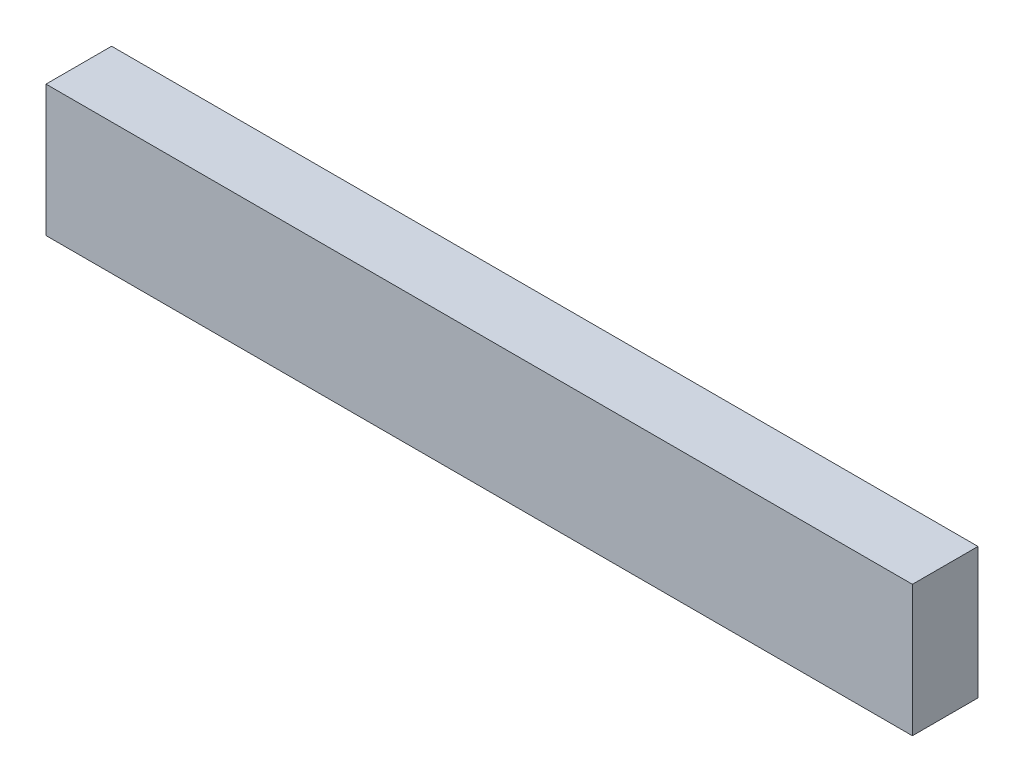
ISO-10303-21;
HEADER;
FILE_DESCRIPTION(('STEP AP214'),'2;1');
FILE_NAME('part.step','',(''),(''),'','','');
FILE_SCHEMA(('AUTOMOTIVE_DESIGN { 1 0 10303 214 1 1 1 1 }'));
ENDSEC;
DATA;
#1=APPLICATION_CONTEXT('core data for automotive mechanical design processes');
#2=APPLICATION_PROTOCOL_DEFINITION('international standard','automotive_design',2000,#1);
#3=PRODUCT_CONTEXT('',#1,'mechanical');
#4=PRODUCT('Part','Part','',(#3));
#5=PRODUCT_RELATED_PRODUCT_CATEGORY('part','',(#4));
#6=PRODUCT_DEFINITION_FORMATION('','',#4);
#7=PRODUCT_DEFINITION_CONTEXT('part definition',#1,'design');
#8=PRODUCT_DEFINITION('design','',#6,#7);
#9=PRODUCT_DEFINITION_SHAPE('','',#8);
#10=(LENGTH_UNIT() NAMED_UNIT(*) SI_UNIT(.MILLI.,.METRE.));
#11=(NAMED_UNIT(*) PLANE_ANGLE_UNIT() SI_UNIT($,.RADIAN.));
#12=(NAMED_UNIT(*) SI_UNIT($,.STERADIAN.) SOLID_ANGLE_UNIT());
#13=UNCERTAINTY_MEASURE_WITH_UNIT(LENGTH_MEASURE(1.E-05),#10,'distance_accuracy_value','');
#14=(GEOMETRIC_REPRESENTATION_CONTEXT(3) GLOBAL_UNCERTAINTY_ASSIGNED_CONTEXT((#13)) GLOBAL_UNIT_ASSIGNED_CONTEXT((#10,
#11,#12)) REPRESENTATION_CONTEXT('',''));
#15=CARTESIAN_POINT('',(0.,0.,0.));
#16=DIRECTION('',(0.,0.,1.));
#17=DIRECTION('',(1.,0.,0.));
#18=AXIS2_PLACEMENT_3D('',#15,#16,#17);
#19=CARTESIAN_POINT('',(0.,200.,0.));
#20=DIRECTION('',(1.,0.,0.));
#21=DIRECTION('',(0.,0.,-1.));
#22=AXIS2_PLACEMENT_3D('',#19,#20,#21);
#23=PLANE('',#22);
#24=DIRECTION('',(0.,0.,1.));
#25=VECTOR('',#24,1.);
#26=CARTESIAN_POINT('',(0.,0.,0.));
#27=LINE('',#26,#25);
#28=CARTESIAN_POINT('',(0.,0.,-100.));
#29=VERTEX_POINT('',#28);
#30=CARTESIAN_POINT('',(0.,0.,0.));
#31=VERTEX_POINT('',#30);
#32=EDGE_CURVE('E109',#29,#31,#27,.T.);
#33=ORIENTED_EDGE('',*,*,#32,.T.);
#34=DIRECTION('',(0.,-1.,0.));
#35=VECTOR('',#34,1.);
#36=CARTESIAN_POINT('',(0.,200.,0.));
#37=LINE('',#36,#35);
#38=CARTESIAN_POINT('',(0.,200.,0.));
#39=VERTEX_POINT('',#38);
#40=EDGE_CURVE('E11',#39,#31,#37,.T.);
#41=ORIENTED_EDGE('',*,*,#40,.F.);
#42=DIRECTION('',(0.,0.,1.));
#43=VECTOR('',#42,1.);
#44=CARTESIAN_POINT('',(0.,200.,0.));
#45=LINE('',#44,#43);
#46=CARTESIAN_POINT('',(0.,200.,-100.));
#47=VERTEX_POINT('',#46);
#48=EDGE_CURVE('E93',#47,#39,#45,.T.);
#49=ORIENTED_EDGE('',*,*,#48,.F.);
#50=DIRECTION('',(0.,-1.,0.));
#51=VECTOR('',#50,1.);
#52=CARTESIAN_POINT('',(0.,200.,-100.));
#53=LINE('',#52,#51);
#54=EDGE_CURVE('E105',#47,#29,#53,.T.);
#55=ORIENTED_EDGE('',*,*,#54,.T.);
#56=EDGE_LOOP('',(#33,#41,#49,#55));
#57=FACE_BOUND('',#56,.T.);
#58=ADVANCED_FACE('F41',(#57),#23,.F.);
#59=CARTESIAN_POINT('',(0.,200.,0.));
#60=DIRECTION('',(0.,0.,-1.));
#61=DIRECTION('',(-1.,0.,0.));
#62=AXIS2_PLACEMENT_3D('',#59,#60,#61);
#63=PLANE('',#62);
#64=DIRECTION('',(1.,0.,0.));
#65=VECTOR('',#64,1.);
#66=CARTESIAN_POINT('',(0.,0.,0.));
#67=LINE('',#66,#65);
#68=CARTESIAN_POINT('',(1320.8,0.,0.));
#69=VERTEX_POINT('',#68);
#70=EDGE_CURVE('E98',#31,#69,#67,.T.);
#71=ORIENTED_EDGE('',*,*,#70,.T.);
#72=DIRECTION('',(0.,-1.,0.));
#73=VECTOR('',#72,1.);
#74=CARTESIAN_POINT('',(1320.8,200.,0.));
#75=LINE('',#74,#73);
#76=CARTESIAN_POINT('',(1320.8,200.,0.));
#77=VERTEX_POINT('',#76);
#78=EDGE_CURVE('E50',#77,#69,#75,.T.);
#79=ORIENTED_EDGE('',*,*,#78,.F.);
#80=DIRECTION('',(1.,0.,0.));
#81=VECTOR('',#80,1.);
#82=CARTESIAN_POINT('',(0.,200.,0.));
#83=LINE('',#82,#81);
#84=EDGE_CURVE('E88',#39,#77,#83,.T.);
#85=ORIENTED_EDGE('',*,*,#84,.F.);
#86=ORIENTED_EDGE('',*,*,#40,.T.);
#87=EDGE_LOOP('',(#71,#79,#85,#86));
#88=FACE_BOUND('',#87,.T.);
#89=ADVANCED_FACE('F97',(#88),#63,.F.);
#90=CARTESIAN_POINT('',(1320.8,200.,0.));
#91=DIRECTION('',(-1.,0.,0.));
#92=DIRECTION('',(0.,0.,1.));
#93=AXIS2_PLACEMENT_3D('',#90,#91,#92);
#94=PLANE('',#93);
#95=DIRECTION('',(0.,0.,-1.));
#96=VECTOR('',#95,1.);
#97=CARTESIAN_POINT('',(1320.8,0.,0.));
#98=LINE('',#97,#96);
#99=CARTESIAN_POINT('',(1320.8,0.,-100.));
#100=VERTEX_POINT('',#99);
#101=EDGE_CURVE('E75',#69,#100,#98,.T.);
#102=ORIENTED_EDGE('',*,*,#101,.T.);
#103=DIRECTION('',(0.,-1.,0.));
#104=VECTOR('',#103,1.);
#105=CARTESIAN_POINT('',(1320.8,200.,-100.));
#106=LINE('',#105,#104);
#107=CARTESIAN_POINT('',(1320.8,200.,-100.));
#108=VERTEX_POINT('',#107);
#109=EDGE_CURVE('E100',#108,#100,#106,.T.);
#110=ORIENTED_EDGE('',*,*,#109,.F.);
#111=DIRECTION('',(0.,0.,-1.));
#112=VECTOR('',#111,1.);
#113=CARTESIAN_POINT('',(1320.8,200.,0.));
#114=LINE('',#113,#112);
#115=EDGE_CURVE('E91',#77,#108,#114,.T.);
#116=ORIENTED_EDGE('',*,*,#115,.F.);
#117=ORIENTED_EDGE('',*,*,#78,.T.);
#118=EDGE_LOOP('',(#102,#110,#116,#117));
#119=FACE_BOUND('',#118,.T.);
#120=ADVANCED_FACE('F101',(#119),#94,.F.);
#121=CARTESIAN_POINT('',(0.,200.,-100.));
#122=DIRECTION('',(0.,0.,1.));
#123=DIRECTION('',(1.,0.,0.));
#124=AXIS2_PLACEMENT_3D('',#121,#122,#123);
#125=PLANE('',#124);
#126=DIRECTION('',(-1.,0.,0.));
#127=VECTOR('',#126,1.);
#128=CARTESIAN_POINT('',(0.,0.,-100.));
#129=LINE('',#128,#127);
#130=EDGE_CURVE('E81',#100,#29,#129,.T.);
#131=ORIENTED_EDGE('',*,*,#130,.T.);
#132=ORIENTED_EDGE('',*,*,#54,.F.);
#133=DIRECTION('',(-1.,0.,0.));
#134=VECTOR('',#133,1.);
#135=CARTESIAN_POINT('',(0.,200.,-100.));
#136=LINE('',#135,#134);
#137=EDGE_CURVE('E58',#108,#47,#136,.T.);
#138=ORIENTED_EDGE('',*,*,#137,.F.);
#139=ORIENTED_EDGE('',*,*,#109,.T.);
#140=EDGE_LOOP('',(#131,#132,#138,#139));
#141=FACE_BOUND('',#140,.T.);
#142=ADVANCED_FACE('F122',(#141),#125,.F.);
#143=CARTESIAN_POINT('',(0.,200.,0.));
#144=DIRECTION('',(0.,-1.,0.));
#145=DIRECTION('',(0.,0.,-1.));
#146=AXIS2_PLACEMENT_3D('',#143,#144,#145);
#147=PLANE('',#146);
#148=ORIENTED_EDGE('',*,*,#48,.T.);
#149=ORIENTED_EDGE('',*,*,#84,.T.);
#150=ORIENTED_EDGE('',*,*,#115,.T.);
#151=ORIENTED_EDGE('',*,*,#137,.T.);
#152=EDGE_LOOP('',(#148,#149,#150,#151));
#153=FACE_BOUND('',#152,.T.);
#154=ADVANCED_FACE('F89',(#153),#147,.F.);
#155=CARTESIAN_POINT('',(0.,0.,0.));
#156=DIRECTION('',(0.,-1.,0.));
#157=DIRECTION('',(0.,0.,-1.));
#158=AXIS2_PLACEMENT_3D('',#155,#156,#157);
#159=PLANE('',#158);
#160=ORIENTED_EDGE('',*,*,#32,.F.);
#161=ORIENTED_EDGE('',*,*,#130,.F.);
#162=ORIENTED_EDGE('',*,*,#101,.F.);
#163=ORIENTED_EDGE('',*,*,#70,.F.);
#164=EDGE_LOOP('',(#160,#161,#162,#163));
#165=FACE_BOUND('',#164,.T.);
#166=ADVANCED_FACE('F125',(#165),#159,.T.);
#167=CLOSED_SHELL('',(#58,#89,#120,#142,#154,#166));
#168=MANIFOLD_SOLID_BREP('B2',#167);
#169=ADVANCED_BREP_SHAPE_REPRESENTATION('',(#18,#168),#14);
#170=SHAPE_DEFINITION_REPRESENTATION(#9,#169);
ENDSEC;
END-ISO-10303-21;
